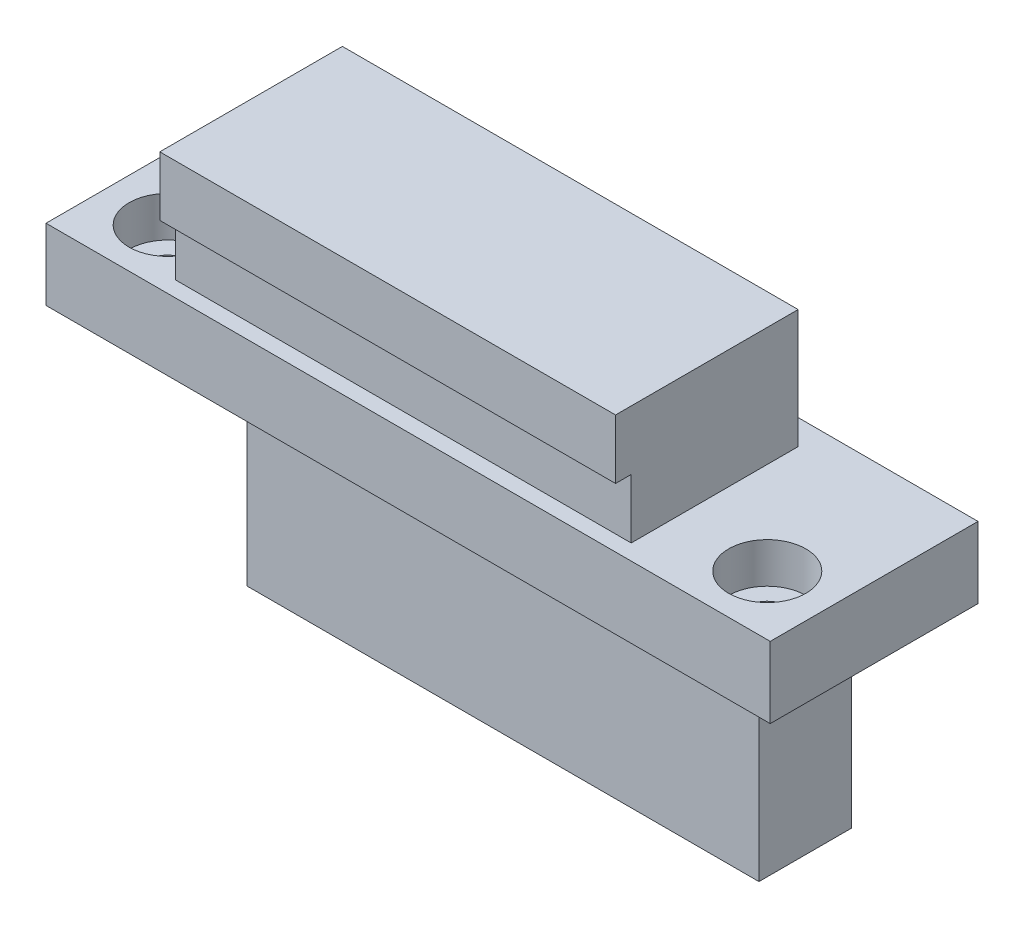
ISO-10303-21;
HEADER;
FILE_DESCRIPTION(('STEP AP214'),'2;1');
FILE_NAME('part.step','',(''),(''),'','','');
FILE_SCHEMA(('AUTOMOTIVE_DESIGN { 1 0 10303 214 1 1 1 1 }'));
ENDSEC;
DATA;
#1=APPLICATION_CONTEXT('core data for automotive mechanical design processes');
#2=APPLICATION_PROTOCOL_DEFINITION('international standard','automotive_design',2000,#1);
#3=PRODUCT_CONTEXT('',#1,'mechanical');
#4=PRODUCT('Part','Part','',(#3));
#5=PRODUCT_RELATED_PRODUCT_CATEGORY('part','',(#4));
#6=PRODUCT_DEFINITION_FORMATION('','',#4);
#7=PRODUCT_DEFINITION_CONTEXT('part definition',#1,'design');
#8=PRODUCT_DEFINITION('design','',#6,#7);
#9=PRODUCT_DEFINITION_SHAPE('','',#8);
#10=(LENGTH_UNIT() NAMED_UNIT(*) SI_UNIT(.MILLI.,.METRE.));
#11=(NAMED_UNIT(*) PLANE_ANGLE_UNIT() SI_UNIT($,.RADIAN.));
#12=(NAMED_UNIT(*) SI_UNIT($,.STERADIAN.) SOLID_ANGLE_UNIT());
#13=UNCERTAINTY_MEASURE_WITH_UNIT(LENGTH_MEASURE(1.E-05),#10,'distance_accuracy_value','');
#14=(GEOMETRIC_REPRESENTATION_CONTEXT(3) GLOBAL_UNCERTAINTY_ASSIGNED_CONTEXT((#13)) GLOBAL_UNIT_ASSIGNED_CONTEXT((#10,
#11,#12)) REPRESENTATION_CONTEXT('',''));
#15=CARTESIAN_POINT('',(0.,0.,0.));
#16=DIRECTION('',(0.,0.,1.));
#17=DIRECTION('',(1.,0.,0.));
#18=AXIS2_PLACEMENT_3D('',#15,#16,#17);
#19=CARTESIAN_POINT('',(-20.9162302005552,16.,7.43089176878442));
#20=DIRECTION('',(0.,0.,-1.));
#21=DIRECTION('',(-1.,0.,0.));
#22=AXIS2_PLACEMENT_3D('',#19,#20,#21);
#23=PLANE('',#22);
#24=DIRECTION('',(1.,0.,0.));
#25=VECTOR('',#24,1.);
#26=CARTESIAN_POINT('',(-20.9162302005552,11.,7.43089176878442));
#27=LINE('',#26,#25);
#28=CARTESIAN_POINT('',(-20.9162302005552,11.,7.43089176878442));
#29=VERTEX_POINT('',#28);
#30=CARTESIAN_POINT('',(17.4714115642587,11.,7.43089176878442));
#31=VERTEX_POINT('',#30);
#32=EDGE_CURVE('E145',#29,#31,#27,.T.);
#33=ORIENTED_EDGE('',*,*,#32,.F.);
#34=DIRECTION('',(0.,-1.,0.));
#35=VECTOR('',#34,1.);
#36=CARTESIAN_POINT('',(-20.9162302005552,16.,7.43089176878442));
#37=LINE('',#36,#35);
#38=CARTESIAN_POINT('',(-20.9162302005552,6.,7.43089176878442));
#39=VERTEX_POINT('',#38);
#40=EDGE_CURVE('E52',#29,#39,#37,.T.);
#41=ORIENTED_EDGE('',*,*,#40,.T.);
#42=DIRECTION('',(1.,0.,0.));
#43=VECTOR('',#42,1.);
#44=CARTESIAN_POINT('',(-20.9162302005552,6.,7.43089176878442));
#45=LINE('',#44,#43);
#46=CARTESIAN_POINT('',(17.4714115642587,6.,7.43089176878442));
#47=VERTEX_POINT('',#46);
#48=EDGE_CURVE('E506',#39,#47,#45,.T.);
#49=ORIENTED_EDGE('',*,*,#48,.T.);
#50=DIRECTION('',(0.,-1.,0.));
#51=VECTOR('',#50,1.);
#52=CARTESIAN_POINT('',(17.4714115642587,16.,7.43089176878442));
#53=LINE('',#52,#51);
#54=EDGE_CURVE('E60',#31,#47,#53,.T.);
#55=ORIENTED_EDGE('',*,*,#54,.F.);
#56=EDGE_LOOP('',(#33,#41,#49,#55));
#57=FACE_BOUND('',#56,.T.);
#58=ADVANCED_FACE('F35',(#57),#23,.F.);
#59=CARTESIAN_POINT('',(0.,6.,0.));
#60=DIRECTION('',(0.,-1.,0.));
#61=DIRECTION('',(0.,0.,-1.));
#62=AXIS2_PLACEMENT_3D('',#59,#60,#61);
#63=PLANE('',#62);
#64=DIRECTION('',(0.,0.,1.));
#65=VECTOR('',#64,1.);
#66=CARTESIAN_POINT('',(-30.5,6.,-8.75));
#67=LINE('',#66,#65);
#68=CARTESIAN_POINT('',(-30.5,6.,-8.75));
#69=VERTEX_POINT('',#68);
#70=CARTESIAN_POINT('',(-30.5,6.,8.75));
#71=VERTEX_POINT('',#70);
#72=EDGE_CURVE('E211',#69,#71,#67,.T.);
#73=ORIENTED_EDGE('',*,*,#72,.T.);
#74=DIRECTION('',(1.,0.,0.));
#75=VECTOR('',#74,1.);
#76=CARTESIAN_POINT('',(30.5,6.,8.75));
#77=LINE('',#76,#75);
#78=CARTESIAN_POINT('',(30.5,6.,8.75));
#79=VERTEX_POINT('',#78);
#80=EDGE_CURVE('E214',#71,#79,#77,.T.);
#81=ORIENTED_EDGE('',*,*,#80,.T.);
#82=DIRECTION('',(0.,0.,-1.));
#83=VECTOR('',#82,1.);
#84=CARTESIAN_POINT('',(30.5,6.,-8.75));
#85=LINE('',#84,#83);
#86=CARTESIAN_POINT('',(30.5,6.,-8.75));
#87=VERTEX_POINT('',#86);
#88=EDGE_CURVE('E217',#79,#87,#85,.T.);
#89=ORIENTED_EDGE('',*,*,#88,.T.);
#90=DIRECTION('',(-1.,0.,0.));
#91=VECTOR('',#90,1.);
#92=CARTESIAN_POINT('',(30.5,6.,-8.75));
#93=LINE('',#92,#91);
#94=EDGE_CURVE('E219',#87,#69,#93,.T.);
#95=ORIENTED_EDGE('',*,*,#94,.T.);
#96=EDGE_LOOP('',(#73,#81,#89,#95));
#97=FACE_BOUND('',#96,.T.);
#98=CARTESIAN_POINT('',(25.25,6.,3.75));
#99=DIRECTION('',(0.,1.,0.));
#100=DIRECTION('',(0.,0.,1.));
#101=AXIS2_PLACEMENT_3D('',#98,#99,#100);
#102=CIRCLE('',#101,3.25);
#103=CARTESIAN_POINT('',(25.25,6.,7.));
#104=VERTEX_POINT('',#103);
#105=EDGE_CURVE('E171',#104,#104,#102,.T.);
#106=ORIENTED_EDGE('',*,*,#105,.F.);
#107=EDGE_LOOP('',(#106));
#108=FACE_BOUND('',#107,.T.);
#109=CARTESIAN_POINT('',(-25.25,6.,3.75));
#110=DIRECTION('',(0.,1.,0.));
#111=DIRECTION('',(0.,0.,1.));
#112=AXIS2_PLACEMENT_3D('',#109,#110,#111);
#113=CIRCLE('',#112,3.25);
#114=CARTESIAN_POINT('',(-25.25,6.,7.));
#115=VERTEX_POINT('',#114);
#116=EDGE_CURVE('E157',#115,#115,#113,.T.);
#117=ORIENTED_EDGE('',*,*,#116,.F.);
#118=EDGE_LOOP('',(#117));
#119=FACE_BOUND('',#118,.T.);
#120=DIRECTION('',(0.,0.,1.));
#121=VECTOR('',#120,1.);
#122=CARTESIAN_POINT('',(-20.9162302005552,6.,7.43089176878442));
#123=LINE('',#122,#121);
#124=CARTESIAN_POINT('',(-20.9162302005552,6.,-6.62965537189564));
#125=VERTEX_POINT('',#124);
#126=EDGE_CURVE('E156',#125,#39,#123,.T.);
#127=ORIENTED_EDGE('',*,*,#126,.F.);
#128=DIRECTION('',(-1.,0.,0.));
#129=VECTOR('',#128,1.);
#130=CARTESIAN_POINT('',(-20.9162302005552,6.,-6.62965537189564));
#131=LINE('',#130,#129);
#132=CARTESIAN_POINT('',(17.4714115642587,6.,-6.62965537189564));
#133=VERTEX_POINT('',#132);
#134=EDGE_CURVE('E505',#133,#125,#131,.T.);
#135=ORIENTED_EDGE('',*,*,#134,.F.);
#136=DIRECTION('',(0.,0.,-1.));
#137=VECTOR('',#136,1.);
#138=CARTESIAN_POINT('',(17.4714115642587,6.,7.43089176878442));
#139=LINE('',#138,#137);
#140=EDGE_CURVE('E516',#47,#133,#139,.T.);
#141=ORIENTED_EDGE('',*,*,#140,.F.);
#142=ORIENTED_EDGE('',*,*,#48,.F.);
#143=EDGE_LOOP('',(#127,#135,#141,#142));
#144=FACE_BOUND('',#143,.T.);
#145=ADVANCED_FACE('F244',(#97,#108,#119,#144),#63,.F.);
#146=CARTESIAN_POINT('',(0.,0.,0.));
#147=DIRECTION('',(0.,-1.,0.));
#148=DIRECTION('',(0.,0.,-1.));
#149=AXIS2_PLACEMENT_3D('',#146,#147,#148);
#150=PLANE('',#149);
#151=CARTESIAN_POINT('',(-25.25,0.,3.75));
#152=DIRECTION('',(0.,-1.,0.));
#153=DIRECTION('',(0.,0.,-1.));
#154=AXIS2_PLACEMENT_3D('',#151,#152,#153);
#155=CIRCLE('',#154,1.7);
#156=CARTESIAN_POINT('',(-25.25,0.,2.05));
#157=VERTEX_POINT('',#156);
#158=EDGE_CURVE('E39',#157,#157,#155,.T.);
#159=ORIENTED_EDGE('',*,*,#158,.F.);
#160=EDGE_LOOP('',(#159));
#161=FACE_BOUND('',#160,.T.);
#162=CARTESIAN_POINT('',(25.25,0.,3.75));
#163=DIRECTION('',(0.,-1.,0.));
#164=DIRECTION('',(0.,0.,-1.));
#165=AXIS2_PLACEMENT_3D('',#162,#163,#164);
#166=CIRCLE('',#165,1.7);
#167=CARTESIAN_POINT('',(25.25,0.,2.05));
#168=VERTEX_POINT('',#167);
#169=EDGE_CURVE('E180',#168,#168,#166,.T.);
#170=ORIENTED_EDGE('',*,*,#169,.F.);
#171=EDGE_LOOP('',(#170));
#172=FACE_BOUND('',#171,.T.);
#173=DIRECTION('',(0.,0.,1.));
#174=VECTOR('',#173,1.);
#175=CARTESIAN_POINT('',(-30.5,0.,-8.75));
#176=LINE('',#175,#174);
#177=CARTESIAN_POINT('',(-30.5,0.,-8.75));
#178=VERTEX_POINT('',#177);
#179=CARTESIAN_POINT('',(-30.5,0.,8.75));
#180=VERTEX_POINT('',#179);
#181=EDGE_CURVE('E210',#178,#180,#176,.T.);
#182=ORIENTED_EDGE('',*,*,#181,.F.);
#183=DIRECTION('',(-1.,0.,0.));
#184=VECTOR('',#183,1.);
#185=CARTESIAN_POINT('',(30.5,0.,-8.75));
#186=LINE('',#185,#184);
#187=CARTESIAN_POINT('',(30.5,0.,-8.75));
#188=VERTEX_POINT('',#187);
#189=EDGE_CURVE('E215',#188,#178,#186,.T.);
#190=ORIENTED_EDGE('',*,*,#189,.F.);
#191=DIRECTION('',(0.,0.,-1.));
#192=VECTOR('',#191,1.);
#193=CARTESIAN_POINT('',(30.5,0.,-8.75));
#194=LINE('',#193,#192);
#195=CARTESIAN_POINT('',(30.5,0.,8.75));
#196=VERTEX_POINT('',#195);
#197=EDGE_CURVE('E226',#196,#188,#194,.T.);
#198=ORIENTED_EDGE('',*,*,#197,.F.);
#199=DIRECTION('',(1.,0.,0.));
#200=VECTOR('',#199,1.);
#201=CARTESIAN_POINT('',(30.5,0.,8.75));
#202=LINE('',#201,#200);
#203=EDGE_CURVE('E224',#180,#196,#202,.T.);
#204=ORIENTED_EDGE('',*,*,#203,.F.);
#205=EDGE_LOOP('',(#182,#190,#198,#204));
#206=FACE_BOUND('',#205,.T.);
#207=DIRECTION('',(-1.,0.,0.));
#208=VECTOR('',#207,1.);
#209=CARTESIAN_POINT('',(21.55,0.,0.749999999999992));
#210=LINE('',#209,#208);
#211=CARTESIAN_POINT('',(21.55,0.,0.749999999999992));
#212=VERTEX_POINT('',#211);
#213=CARTESIAN_POINT('',(-21.55,0.,0.749999999999987));
#214=VERTEX_POINT('',#213);
#215=EDGE_CURVE('E195',#212,#214,#210,.T.);
#216=ORIENTED_EDGE('',*,*,#215,.F.);
#217=DIRECTION('',(0.,0.,1.));
#218=VECTOR('',#217,1.);
#219=CARTESIAN_POINT('',(21.55,0.,-7.05000000000001));
#220=LINE('',#219,#218);
#221=CARTESIAN_POINT('',(21.55,0.,-7.05000000000001));
#222=VERTEX_POINT('',#221);
#223=EDGE_CURVE('E192',#222,#212,#220,.T.);
#224=ORIENTED_EDGE('',*,*,#223,.F.);
#225=DIRECTION('',(1.,0.,0.));
#226=VECTOR('',#225,1.);
#227=CARTESIAN_POINT('',(21.55,0.,-7.05000000000001));
#228=LINE('',#227,#226);
#229=CARTESIAN_POINT('',(-21.55,0.,-7.05000000000001));
#230=VERTEX_POINT('',#229);
#231=EDGE_CURVE('E185',#230,#222,#228,.T.);
#232=ORIENTED_EDGE('',*,*,#231,.F.);
#233=DIRECTION('',(0.,0.,-1.));
#234=VECTOR('',#233,1.);
#235=CARTESIAN_POINT('',(-21.55,0.,-7.05000000000001));
#236=LINE('',#235,#234);
#237=EDGE_CURVE('E197',#214,#230,#236,.T.);
#238=ORIENTED_EDGE('',*,*,#237,.F.);
#239=EDGE_LOOP('',(#216,#224,#232,#238));
#240=FACE_BOUND('',#239,.T.);
#241=ADVANCED_FACE('F241',(#161,#172,#206,#240),#150,.T.);
#242=CARTESIAN_POINT('',(-30.5,6.,-8.75));
#243=DIRECTION('',(1.,0.,0.));
#244=DIRECTION('',(0.,0.,-1.));
#245=AXIS2_PLACEMENT_3D('',#242,#243,#244);
#246=PLANE('',#245);
#247=ORIENTED_EDGE('',*,*,#181,.T.);
#248=DIRECTION('',(0.,-1.,0.));
#249=VECTOR('',#248,1.);
#250=CARTESIAN_POINT('',(-30.5,6.,8.75));
#251=LINE('',#250,#249);
#252=EDGE_CURVE('E11',#71,#180,#251,.T.);
#253=ORIENTED_EDGE('',*,*,#252,.F.);
#254=ORIENTED_EDGE('',*,*,#72,.F.);
#255=DIRECTION('',(0.,-1.,0.));
#256=VECTOR('',#255,1.);
#257=CARTESIAN_POINT('',(-30.5,6.,-8.75));
#258=LINE('',#257,#256);
#259=EDGE_CURVE('E221',#69,#178,#258,.T.);
#260=ORIENTED_EDGE('',*,*,#259,.T.);
#261=EDGE_LOOP('',(#247,#253,#254,#260));
#262=FACE_BOUND('',#261,.T.);
#263=ADVANCED_FACE('F37',(#262),#246,.F.);
#264=CARTESIAN_POINT('',(30.5,6.,8.75));
#265=DIRECTION('',(0.,0.,-1.));
#266=DIRECTION('',(-1.,0.,0.));
#267=AXIS2_PLACEMENT_3D('',#264,#265,#266);
#268=PLANE('',#267);
#269=ORIENTED_EDGE('',*,*,#203,.T.);
#270=DIRECTION('',(0.,-1.,0.));
#271=VECTOR('',#270,1.);
#272=CARTESIAN_POINT('',(30.5,6.,8.75));
#273=LINE('',#272,#271);
#274=EDGE_CURVE('E44',#79,#196,#273,.T.);
#275=ORIENTED_EDGE('',*,*,#274,.F.);
#276=ORIENTED_EDGE('',*,*,#80,.F.);
#277=ORIENTED_EDGE('',*,*,#252,.T.);
#278=EDGE_LOOP('',(#269,#275,#276,#277));
#279=FACE_BOUND('',#278,.T.);
#280=ADVANCED_FACE('F465',(#279),#268,.F.);
#281=CARTESIAN_POINT('',(30.5,6.,-8.75));
#282=DIRECTION('',(-1.,0.,0.));
#283=DIRECTION('',(0.,0.,1.));
#284=AXIS2_PLACEMENT_3D('',#281,#282,#283);
#285=PLANE('',#284);
#286=ORIENTED_EDGE('',*,*,#197,.T.);
#287=DIRECTION('',(0.,-1.,0.));
#288=VECTOR('',#287,1.);
#289=CARTESIAN_POINT('',(30.5,6.,-8.75));
#290=LINE('',#289,#288);
#291=EDGE_CURVE('E231',#87,#188,#290,.T.);
#292=ORIENTED_EDGE('',*,*,#291,.F.);
#293=ORIENTED_EDGE('',*,*,#88,.F.);
#294=ORIENTED_EDGE('',*,*,#274,.T.);
#295=EDGE_LOOP('',(#286,#292,#293,#294));
#296=FACE_BOUND('',#295,.T.);
#297=ADVANCED_FACE('F456',(#296),#285,.F.);
#298=CARTESIAN_POINT('',(30.5,6.,-8.75));
#299=DIRECTION('',(0.,0.,1.));
#300=DIRECTION('',(1.,0.,0.));
#301=AXIS2_PLACEMENT_3D('',#298,#299,#300);
#302=PLANE('',#301);
#303=ORIENTED_EDGE('',*,*,#189,.T.);
#304=ORIENTED_EDGE('',*,*,#259,.F.);
#305=ORIENTED_EDGE('',*,*,#94,.F.);
#306=ORIENTED_EDGE('',*,*,#291,.T.);
#307=EDGE_LOOP('',(#303,#304,#305,#306));
#308=FACE_BOUND('',#307,.T.);
#309=ADVANCED_FACE('F444',(#308),#302,.F.);
#310=CARTESIAN_POINT('',(21.55,-20.,-7.05000000000001));
#311=DIRECTION('',(-1.,0.,0.));
#312=DIRECTION('',(0.,0.,1.));
#313=AXIS2_PLACEMENT_3D('',#310,#311,#312);
#314=PLANE('',#313);
#315=ORIENTED_EDGE('',*,*,#223,.T.);
#316=DIRECTION('',(0.,1.,0.));
#317=VECTOR('',#316,1.);
#318=CARTESIAN_POINT('',(21.55,-20.,0.749999999999992));
#319=LINE('',#318,#317);
#320=CARTESIAN_POINT('',(21.55,-20.,0.749999999999992));
#321=VERTEX_POINT('',#320);
#322=EDGE_CURVE('E208',#321,#212,#319,.T.);
#323=ORIENTED_EDGE('',*,*,#322,.F.);
#324=DIRECTION('',(0.,0.,1.));
#325=VECTOR('',#324,1.);
#326=CARTESIAN_POINT('',(21.55,-20.,-7.05000000000001));
#327=LINE('',#326,#325);
#328=CARTESIAN_POINT('',(21.55,-20.,-7.05000000000001));
#329=VERTEX_POINT('',#328);
#330=EDGE_CURVE('E181',#329,#321,#327,.T.);
#331=ORIENTED_EDGE('',*,*,#330,.F.);
#332=DIRECTION('',(0.,1.,0.));
#333=VECTOR('',#332,1.);
#334=CARTESIAN_POINT('',(21.55,-20.,-7.05000000000001));
#335=LINE('',#334,#333);
#336=EDGE_CURVE('E191',#329,#222,#335,.T.);
#337=ORIENTED_EDGE('',*,*,#336,.T.);
#338=EDGE_LOOP('',(#315,#323,#331,#337));
#339=FACE_BOUND('',#338,.T.);
#340=ADVANCED_FACE('F268',(#339),#314,.F.);
#341=CARTESIAN_POINT('',(21.55,-20.,0.749999999999992));
#342=DIRECTION('',(0.,0.,-1.));
#343=DIRECTION('',(-1.,0.,0.));
#344=AXIS2_PLACEMENT_3D('',#341,#342,#343);
#345=PLANE('',#344);
#346=ORIENTED_EDGE('',*,*,#215,.T.);
#347=DIRECTION('',(0.,1.,0.));
#348=VECTOR('',#347,1.);
#349=CARTESIAN_POINT('',(-21.55,-20.,0.749999999999987));
#350=LINE('',#349,#348);
#351=CARTESIAN_POINT('',(-21.55,-20.,0.749999999999987));
#352=VERTEX_POINT('',#351);
#353=EDGE_CURVE('E205',#352,#214,#350,.T.);
#354=ORIENTED_EDGE('',*,*,#353,.F.);
#355=DIRECTION('',(-1.,0.,0.));
#356=VECTOR('',#355,1.);
#357=CARTESIAN_POINT('',(21.55,-20.,0.749999999999992));
#358=LINE('',#357,#356);
#359=EDGE_CURVE('E184',#321,#352,#358,.T.);
#360=ORIENTED_EDGE('',*,*,#359,.F.);
#361=ORIENTED_EDGE('',*,*,#322,.T.);
#362=EDGE_LOOP('',(#346,#354,#360,#361));
#363=FACE_BOUND('',#362,.T.);
#364=ADVANCED_FACE('F256',(#363),#345,.F.);
#365=CARTESIAN_POINT('',(-21.55,-20.,-7.05000000000001));
#366=DIRECTION('',(1.,0.,0.));
#367=DIRECTION('',(0.,0.,-1.));
#368=AXIS2_PLACEMENT_3D('',#365,#366,#367);
#369=PLANE('',#368);
#370=ORIENTED_EDGE('',*,*,#237,.T.);
#371=DIRECTION('',(0.,1.,0.));
#372=VECTOR('',#371,1.);
#373=CARTESIAN_POINT('',(-21.55,-20.,-7.05000000000001));
#374=LINE('',#373,#372);
#375=CARTESIAN_POINT('',(-21.55,-20.,-7.05000000000001));
#376=VERTEX_POINT('',#375);
#377=EDGE_CURVE('E203',#376,#230,#374,.T.);
#378=ORIENTED_EDGE('',*,*,#377,.F.);
#379=DIRECTION('',(0.,0.,-1.));
#380=VECTOR('',#379,1.);
#381=CARTESIAN_POINT('',(-21.55,-20.,-7.05000000000001));
#382=LINE('',#381,#380);
#383=EDGE_CURVE('E187',#352,#376,#382,.T.);
#384=ORIENTED_EDGE('',*,*,#383,.F.);
#385=ORIENTED_EDGE('',*,*,#353,.T.);
#386=EDGE_LOOP('',(#370,#378,#384,#385));
#387=FACE_BOUND('',#386,.T.);
#388=ADVANCED_FACE('F260',(#387),#369,.F.);
#389=CARTESIAN_POINT('',(21.55,-20.,-7.05000000000001));
#390=DIRECTION('',(0.,0.,1.));
#391=DIRECTION('',(1.,0.,0.));
#392=AXIS2_PLACEMENT_3D('',#389,#390,#391);
#393=PLANE('',#392);
#394=ORIENTED_EDGE('',*,*,#231,.T.);
#395=ORIENTED_EDGE('',*,*,#336,.F.);
#396=DIRECTION('',(1.,0.,0.));
#397=VECTOR('',#396,1.);
#398=CARTESIAN_POINT('',(21.55,-20.,-7.05000000000001));
#399=LINE('',#398,#397);
#400=EDGE_CURVE('E189',#376,#329,#399,.T.);
#401=ORIENTED_EDGE('',*,*,#400,.F.);
#402=ORIENTED_EDGE('',*,*,#377,.T.);
#403=EDGE_LOOP('',(#394,#395,#401,#402));
#404=FACE_BOUND('',#403,.T.);
#405=ADVANCED_FACE('F270',(#404),#393,.F.);
#406=CARTESIAN_POINT('',(0.,-20.,0.));
#407=DIRECTION('',(0.,-1.,0.));
#408=DIRECTION('',(0.,0.,-1.));
#409=AXIS2_PLACEMENT_3D('',#406,#407,#408);
#410=PLANE('',#409);
#411=ORIENTED_EDGE('',*,*,#330,.T.);
#412=ORIENTED_EDGE('',*,*,#359,.T.);
#413=ORIENTED_EDGE('',*,*,#383,.T.);
#414=ORIENTED_EDGE('',*,*,#400,.T.);
#415=EDGE_LOOP('',(#411,#412,#413,#414));
#416=FACE_BOUND('',#415,.T.);
#417=ADVANCED_FACE('F264',(#416),#410,.T.);
#418=CARTESIAN_POINT('',(25.25,6.,3.75));
#419=DIRECTION('',(0.,1.,0.));
#420=DIRECTION('',(0.,0.,1.));
#421=AXIS2_PLACEMENT_3D('',#418,#419,#420);
#422=CYLINDRICAL_SURFACE('',#421,1.7);
#423=ORIENTED_EDGE('',*,*,#169,.T.);
#424=EDGE_LOOP('',(#423));
#425=FACE_BOUND('',#424,.T.);
#426=CARTESIAN_POINT('',(25.25,2.6,3.75));
#427=DIRECTION('',(0.,1.,0.));
#428=DIRECTION('',(0.,0.,1.));
#429=AXIS2_PLACEMENT_3D('',#426,#427,#428);
#430=CIRCLE('',#429,1.7);
#431=CARTESIAN_POINT('',(25.25,2.6,5.45));
#432=VERTEX_POINT('',#431);
#433=EDGE_CURVE('E177',#432,#432,#430,.T.);
#434=ORIENTED_EDGE('',*,*,#433,.T.);
#435=EDGE_LOOP('',(#434));
#436=FACE_BOUND('',#435,.T.);
#437=ADVANCED_FACE('F238',(#425,#436),#422,.F.);
#438=CARTESIAN_POINT('',(26.95,2.6,3.75));
#439=DIRECTION('',(0.,-1.,0.));
#440=DIRECTION('',(0.,0.,-1.));
#441=AXIS2_PLACEMENT_3D('',#438,#439,#440);
#442=PLANE('',#441);
#443=ORIENTED_EDGE('',*,*,#433,.F.);
#444=EDGE_LOOP('',(#443));
#445=FACE_BOUND('',#444,.T.);
#446=CARTESIAN_POINT('',(25.25,2.6,3.75));
#447=DIRECTION('',(0.,1.,0.));
#448=DIRECTION('',(0.,0.,1.));
#449=AXIS2_PLACEMENT_3D('',#446,#447,#448);
#450=CIRCLE('',#449,3.25);
#451=CARTESIAN_POINT('',(25.25,2.6,7.));
#452=VERTEX_POINT('',#451);
#453=EDGE_CURVE('E174',#452,#452,#450,.T.);
#454=ORIENTED_EDGE('',*,*,#453,.T.);
#455=EDGE_LOOP('',(#454));
#456=FACE_BOUND('',#455,.T.);
#457=ADVANCED_FACE('F307',(#445,#456),#442,.F.);
#458=CARTESIAN_POINT('',(25.25,6.,3.75));
#459=DIRECTION('',(0.,1.,0.));
#460=DIRECTION('',(0.,0.,1.));
#461=AXIS2_PLACEMENT_3D('',#458,#459,#460);
#462=CYLINDRICAL_SURFACE('',#461,3.25);
#463=ORIENTED_EDGE('',*,*,#453,.F.);
#464=EDGE_LOOP('',(#463));
#465=FACE_BOUND('',#464,.T.);
#466=ORIENTED_EDGE('',*,*,#105,.T.);
#467=EDGE_LOOP('',(#466));
#468=FACE_BOUND('',#467,.T.);
#469=ADVANCED_FACE('F303',(#465,#468),#462,.F.);
#470=CARTESIAN_POINT('',(-25.25,6.,3.75));
#471=DIRECTION('',(0.,1.,0.));
#472=DIRECTION('',(0.,0.,1.));
#473=AXIS2_PLACEMENT_3D('',#470,#471,#472);
#474=CYLINDRICAL_SURFACE('',#473,1.7);
#475=ORIENTED_EDGE('',*,*,#158,.T.);
#476=EDGE_LOOP('',(#475));
#477=FACE_BOUND('',#476,.T.);
#478=CARTESIAN_POINT('',(-25.25,2.6,3.75));
#479=DIRECTION('',(0.,1.,0.));
#480=DIRECTION('',(0.,0.,1.));
#481=AXIS2_PLACEMENT_3D('',#478,#479,#480);
#482=CIRCLE('',#481,1.7);
#483=CARTESIAN_POINT('',(-25.25,2.6,5.45));
#484=VERTEX_POINT('',#483);
#485=EDGE_CURVE('E168',#484,#484,#482,.T.);
#486=ORIENTED_EDGE('',*,*,#485,.T.);
#487=EDGE_LOOP('',(#486));
#488=FACE_BOUND('',#487,.T.);
#489=ADVANCED_FACE('F299',(#477,#488),#474,.F.);
#490=CARTESIAN_POINT('',(-23.55,2.6,3.75));
#491=DIRECTION('',(0.,-1.,0.));
#492=DIRECTION('',(0.,0.,-1.));
#493=AXIS2_PLACEMENT_3D('',#490,#491,#492);
#494=PLANE('',#493);
#495=ORIENTED_EDGE('',*,*,#485,.F.);
#496=EDGE_LOOP('',(#495));
#497=FACE_BOUND('',#496,.T.);
#498=CARTESIAN_POINT('',(-25.25,2.6,3.75));
#499=DIRECTION('',(0.,1.,0.));
#500=DIRECTION('',(0.,0.,1.));
#501=AXIS2_PLACEMENT_3D('',#498,#499,#500);
#502=CIRCLE('',#501,3.25);
#503=CARTESIAN_POINT('',(-25.25,2.6,7.));
#504=VERTEX_POINT('',#503);
#505=EDGE_CURVE('E160',#504,#504,#502,.T.);
#506=ORIENTED_EDGE('',*,*,#505,.T.);
#507=EDGE_LOOP('',(#506));
#508=FACE_BOUND('',#507,.T.);
#509=ADVANCED_FACE('F295',(#497,#508),#494,.F.);
#510=CARTESIAN_POINT('',(-25.25,6.,3.75));
#511=DIRECTION('',(0.,1.,0.));
#512=DIRECTION('',(0.,0.,1.));
#513=AXIS2_PLACEMENT_3D('',#510,#511,#512);
#514=CYLINDRICAL_SURFACE('',#513,3.25);
#515=ORIENTED_EDGE('',*,*,#505,.F.);
#516=EDGE_LOOP('',(#515));
#517=FACE_BOUND('',#516,.T.);
#518=ORIENTED_EDGE('',*,*,#116,.T.);
#519=EDGE_LOOP('',(#518));
#520=FACE_BOUND('',#519,.T.);
#521=ADVANCED_FACE('F292',(#517,#520),#514,.F.);
#522=CARTESIAN_POINT('',(-20.9162302005552,16.,7.43089176878442));
#523=DIRECTION('',(1.,0.,0.));
#524=DIRECTION('',(0.,0.,-1.));
#525=AXIS2_PLACEMENT_3D('',#522,#523,#524);
#526=PLANE('',#525);
#527=ORIENTED_EDGE('',*,*,#126,.T.);
#528=ORIENTED_EDGE('',*,*,#40,.F.);
#529=DIRECTION('',(0.,0.,-1.));
#530=VECTOR('',#529,1.);
#531=CARTESIAN_POINT('',(-20.9162302005552,11.,47.461897916063));
#532=LINE('',#531,#530);
#533=CARTESIAN_POINT('',(-20.9162302005552,11.,8.75000000000001));
#534=VERTEX_POINT('',#533);
#535=EDGE_CURVE('E142',#534,#29,#532,.T.);
#536=ORIENTED_EDGE('',*,*,#535,.F.);
#537=DIRECTION('',(0.,1.,0.));
#538=VECTOR('',#537,1.);
#539=CARTESIAN_POINT('',(-20.9162302005552,16.,8.75000000000001));
#540=LINE('',#539,#538);
#541=CARTESIAN_POINT('',(-20.9162302005552,16.,8.75000000000001));
#542=VERTEX_POINT('',#541);
#543=EDGE_CURVE('E507',#534,#542,#540,.T.);
#544=ORIENTED_EDGE('',*,*,#543,.T.);
#545=DIRECTION('',(0.,0.,1.));
#546=VECTOR('',#545,1.);
#547=CARTESIAN_POINT('',(-20.9162302005552,16.,7.43089176878442));
#548=LINE('',#547,#546);
#549=CARTESIAN_POINT('',(-20.9162302005552,16.,-6.62965537189564));
#550=VERTEX_POINT('',#549);
#551=EDGE_CURVE('E515',#550,#542,#548,.T.);
#552=ORIENTED_EDGE('',*,*,#551,.F.);
#553=DIRECTION('',(0.,-1.,0.));
#554=VECTOR('',#553,1.);
#555=CARTESIAN_POINT('',(-20.9162302005552,16.,-6.62965537189564));
#556=LINE('',#555,#554);
#557=EDGE_CURVE('E512',#550,#125,#556,.T.);
#558=ORIENTED_EDGE('',*,*,#557,.T.);
#559=EDGE_LOOP('',(#527,#528,#536,#544,#552,#558));
#560=FACE_BOUND('',#559,.T.);
#561=ADVANCED_FACE('F154',(#560),#526,.F.);
#562=CARTESIAN_POINT('',(17.4714115642587,16.,7.43089176878442));
#563=DIRECTION('',(-1.,0.,0.));
#564=DIRECTION('',(0.,0.,1.));
#565=AXIS2_PLACEMENT_3D('',#562,#563,#564);
#566=PLANE('',#565);
#567=ORIENTED_EDGE('',*,*,#140,.T.);
#568=DIRECTION('',(0.,-1.,0.));
#569=VECTOR('',#568,1.);
#570=CARTESIAN_POINT('',(17.4714115642587,16.,-6.62965537189564));
#571=LINE('',#570,#569);
#572=CARTESIAN_POINT('',(17.4714115642587,16.,-6.62965537189564));
#573=VERTEX_POINT('',#572);
#574=EDGE_CURVE('E162',#573,#133,#571,.T.);
#575=ORIENTED_EDGE('',*,*,#574,.F.);
#576=DIRECTION('',(0.,0.,-1.));
#577=VECTOR('',#576,1.);
#578=CARTESIAN_POINT('',(17.4714115642587,16.,7.43089176878442));
#579=LINE('',#578,#577);
#580=CARTESIAN_POINT('',(17.4714115642587,16.,8.75));
#581=VERTEX_POINT('',#580);
#582=EDGE_CURVE('E520',#581,#573,#579,.T.);
#583=ORIENTED_EDGE('',*,*,#582,.F.);
#584=DIRECTION('',(0.,-1.,0.));
#585=VECTOR('',#584,1.);
#586=CARTESIAN_POINT('',(17.4714115642587,16.,8.75));
#587=LINE('',#586,#585);
#588=CARTESIAN_POINT('',(17.4714115642587,11.,8.75));
#589=VERTEX_POINT('',#588);
#590=EDGE_CURVE('E528',#581,#589,#587,.T.);
#591=ORIENTED_EDGE('',*,*,#590,.T.);
#592=DIRECTION('',(0.,0.,-1.));
#593=VECTOR('',#592,1.);
#594=CARTESIAN_POINT('',(17.4714115642587,11.,47.461897916063));
#595=LINE('',#594,#593);
#596=EDGE_CURVE('E150',#589,#31,#595,.T.);
#597=ORIENTED_EDGE('',*,*,#596,.T.);
#598=ORIENTED_EDGE('',*,*,#54,.T.);
#599=EDGE_LOOP('',(#567,#575,#583,#591,#597,#598));
#600=FACE_BOUND('',#599,.T.);
#601=ADVANCED_FACE('F288',(#600),#566,.F.);
#602=CARTESIAN_POINT('',(-20.9162302005552,16.,-6.62965537189564));
#603=DIRECTION('',(0.,0.,1.));
#604=DIRECTION('',(1.,0.,0.));
#605=AXIS2_PLACEMENT_3D('',#602,#603,#604);
#606=PLANE('',#605);
#607=ORIENTED_EDGE('',*,*,#134,.T.);
#608=ORIENTED_EDGE('',*,*,#557,.F.);
#609=DIRECTION('',(-1.,0.,0.));
#610=VECTOR('',#609,1.);
#611=CARTESIAN_POINT('',(-20.9162302005552,16.,-6.62965537189564));
#612=LINE('',#611,#610);
#613=EDGE_CURVE('E518',#573,#550,#612,.T.);
#614=ORIENTED_EDGE('',*,*,#613,.F.);
#615=ORIENTED_EDGE('',*,*,#574,.T.);
#616=EDGE_LOOP('',(#607,#608,#614,#615));
#617=FACE_BOUND('',#616,.T.);
#618=ADVANCED_FACE('F349',(#617),#606,.F.);
#619=CARTESIAN_POINT('',(0.,16.,0.));
#620=DIRECTION('',(0.,-1.,0.));
#621=DIRECTION('',(0.,0.,-1.));
#622=AXIS2_PLACEMENT_3D('',#619,#620,#621);
#623=PLANE('',#622);
#624=ORIENTED_EDGE('',*,*,#551,.T.);
#625=DIRECTION('',(1.,0.,0.));
#626=VECTOR('',#625,1.);
#627=CARTESIAN_POINT('',(-20.9162302005552,16.,8.75000000000001));
#628=LINE('',#627,#626);
#629=EDGE_CURVE('E149',#542,#581,#628,.T.);
#630=ORIENTED_EDGE('',*,*,#629,.T.);
#631=ORIENTED_EDGE('',*,*,#582,.T.);
#632=ORIENTED_EDGE('',*,*,#613,.T.);
#633=EDGE_LOOP('',(#624,#630,#631,#632));
#634=FACE_BOUND('',#633,.T.);
#635=ADVANCED_FACE('F356',(#634),#623,.F.);
#636=CARTESIAN_POINT('',(-20.9162302005552,11.,47.461897916063));
#637=DIRECTION('',(0.,1.,0.));
#638=DIRECTION('',(0.,0.,1.));
#639=AXIS2_PLACEMENT_3D('',#636,#637,#638);
#640=PLANE('',#639);
#641=ORIENTED_EDGE('',*,*,#596,.F.);
#642=DIRECTION('',(-1.,0.,0.));
#643=VECTOR('',#642,1.);
#644=CARTESIAN_POINT('',(-20.9162302005552,11.,8.75000000000001));
#645=LINE('',#644,#643);
#646=EDGE_CURVE('E146',#589,#534,#645,.T.);
#647=ORIENTED_EDGE('',*,*,#646,.T.);
#648=ORIENTED_EDGE('',*,*,#535,.T.);
#649=ORIENTED_EDGE('',*,*,#32,.T.);
#650=EDGE_LOOP('',(#641,#647,#648,#649));
#651=FACE_BOUND('',#650,.T.);
#652=ADVANCED_FACE('F144',(#651),#640,.F.);
#653=CARTESIAN_POINT('',(30.5,6.,8.75));
#654=DIRECTION('',(0.,0.,-1.));
#655=DIRECTION('',(-1.,0.,0.));
#656=AXIS2_PLACEMENT_3D('',#653,#654,#655);
#657=PLANE('',#656);
#658=ORIENTED_EDGE('',*,*,#646,.F.);
#659=ORIENTED_EDGE('',*,*,#590,.F.);
#660=ORIENTED_EDGE('',*,*,#629,.F.);
#661=ORIENTED_EDGE('',*,*,#543,.F.);
#662=EDGE_LOOP('',(#658,#659,#660,#661));
#663=FACE_BOUND('',#662,.T.);
#664=ADVANCED_FACE('F369',(#663),#657,.F.);
#665=CLOSED_SHELL('',(#58,#145,#241,#263,#280,#297,#309,#340,#364,#388,#405,#417,#437,#457,#469,
#489,#509,#521,#561,#601,#618,#635,#652,#664));
#666=MANIFOLD_SOLID_BREP('B2',#665);
#667=ADVANCED_BREP_SHAPE_REPRESENTATION('',(#18,#666),#14);
#668=SHAPE_DEFINITION_REPRESENTATION(#9,#667);
ENDSEC;
END-ISO-10303-21;
